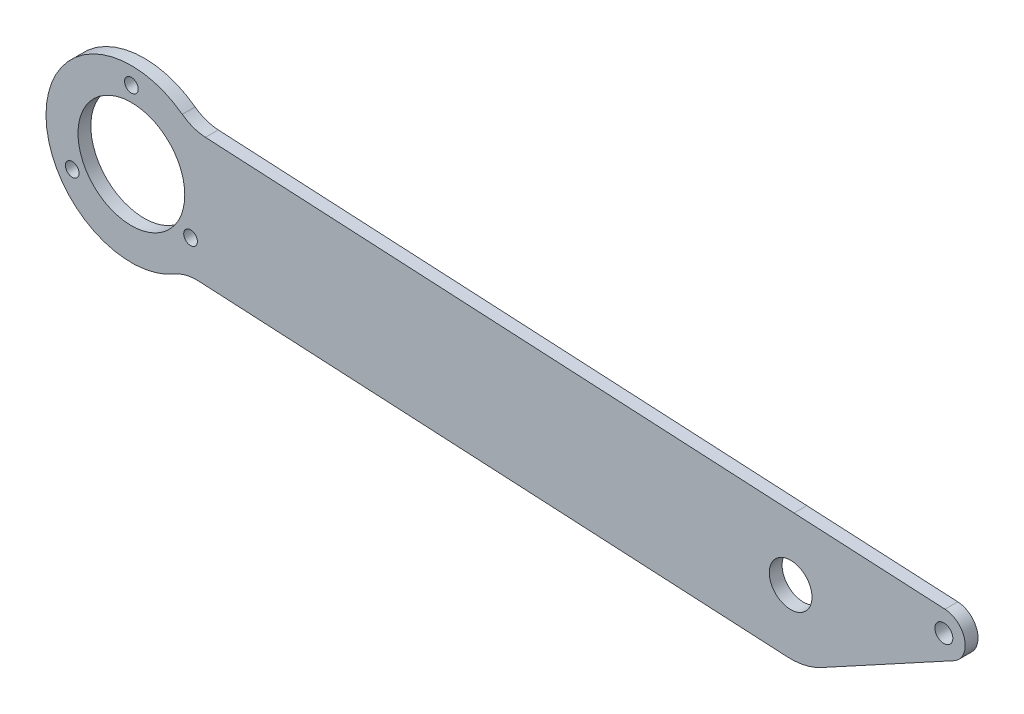
ISO-10303-21;
HEADER;
FILE_DESCRIPTION(('STEP AP214'),'2;1');
FILE_NAME('part.step','',(''),(''),'','','');
FILE_SCHEMA(('AUTOMOTIVE_DESIGN { 1 0 10303 214 1 1 1 1 }'));
ENDSEC;
DATA;
#1=APPLICATION_CONTEXT('core data for automotive mechanical design processes');
#2=APPLICATION_PROTOCOL_DEFINITION('international standard','automotive_design',2000,#1);
#3=PRODUCT_CONTEXT('',#1,'mechanical');
#4=PRODUCT('Part','Part','',(#3));
#5=PRODUCT_RELATED_PRODUCT_CATEGORY('part','',(#4));
#6=PRODUCT_DEFINITION_FORMATION('','',#4);
#7=PRODUCT_DEFINITION_CONTEXT('part definition',#1,'design');
#8=PRODUCT_DEFINITION('design','',#6,#7);
#9=PRODUCT_DEFINITION_SHAPE('','',#8);
#10=(LENGTH_UNIT() NAMED_UNIT(*) SI_UNIT(.MILLI.,.METRE.));
#11=(NAMED_UNIT(*) PLANE_ANGLE_UNIT() SI_UNIT($,.RADIAN.));
#12=(NAMED_UNIT(*) SI_UNIT($,.STERADIAN.) SOLID_ANGLE_UNIT());
#13=UNCERTAINTY_MEASURE_WITH_UNIT(LENGTH_MEASURE(1.E-05),#10,'distance_accuracy_value','');
#14=(GEOMETRIC_REPRESENTATION_CONTEXT(3) GLOBAL_UNCERTAINTY_ASSIGNED_CONTEXT((#13)) GLOBAL_UNIT_ASSIGNED_CONTEXT((#10,
#11,#12)) REPRESENTATION_CONTEXT('',''));
#15=CARTESIAN_POINT('',(0.,0.,0.));
#16=DIRECTION('',(0.,0.,1.));
#17=DIRECTION('',(1.,0.,0.));
#18=AXIS2_PLACEMENT_3D('',#15,#16,#17);
#19=CARTESIAN_POINT('',(15.241508082376,-25.839822587914,3.));
#20=DIRECTION('',(0.,0.,-1.));
#21=DIRECTION('',(-1.,0.,0.));
#22=AXIS2_PLACEMENT_3D('',#19,#20,#21);
#23=CYLINDRICAL_SURFACE('',#22,10.);
#24=DIRECTION('',(0.,0.,1.));
#25=VECTOR('',#24,1.);
#26=CARTESIAN_POINT('',(15.7689222913527,-15.853740560804,3.));
#27=LINE('',#26,#25);
#28=CARTESIAN_POINT('',(15.7689222913527,-15.853740560804,3.));
#29=VERTEX_POINT('',#28);
#30=CARTESIAN_POINT('',(15.7689222913527,-15.853740560804,0.));
#31=VERTEX_POINT('',#30);
#32=EDGE_CURVE('E149',#29,#31,#27,.F.);
#33=ORIENTED_EDGE('',*,*,#32,.F.);
#34=CARTESIAN_POINT('',(15.241508082376,-25.839822587914,3.));
#35=DIRECTION('',(0.,0.,1.));
#36=DIRECTION('',(1.,0.,0.));
#37=AXIS2_PLACEMENT_3D('',#34,#35,#36);
#38=CIRCLE('',#37,10.);
#39=CARTESIAN_POINT('',(10.1610053882507,-17.2265483919426,3.));
#40=VERTEX_POINT('',#39);
#41=EDGE_CURVE('E46',#29,#40,#38,.T.);
#42=ORIENTED_EDGE('',*,*,#41,.T.);
#43=DIRECTION('',(0.,0.,-1.));
#44=VECTOR('',#43,1.);
#45=CARTESIAN_POINT('',(10.1610053882507,-17.2265483919427,3.));
#46=LINE('',#45,#44);
#47=CARTESIAN_POINT('',(10.1610053882507,-17.2265483919426,0.));
#48=VERTEX_POINT('',#47);
#49=EDGE_CURVE('E152',#48,#40,#46,.F.);
#50=ORIENTED_EDGE('',*,*,#49,.F.);
#51=CARTESIAN_POINT('',(15.241508082376,-25.839822587914,0.));
#52=DIRECTION('',(0.,0.,1.));
#53=DIRECTION('',(1.,0.,0.));
#54=AXIS2_PLACEMENT_3D('',#51,#52,#53);
#55=CIRCLE('',#54,10.);
#56=EDGE_CURVE('E11',#48,#31,#55,.F.);
#57=ORIENTED_EDGE('',*,*,#56,.T.);
#58=EDGE_LOOP('',(#33,#42,#50,#57));
#59=FACE_BOUND('',#58,.T.);
#60=ADVANCED_FACE('F39',(#59),#23,.F.);
#61=CARTESIAN_POINT('',(17.8785791272596,24.0905875476361,3.));
#62=DIRECTION('',(0.,0.,-1.));
#63=DIRECTION('',(-1.,0.,0.));
#64=AXIS2_PLACEMENT_3D('',#61,#62,#63);
#65=CYLINDRICAL_SURFACE('',#64,10.);
#66=DIRECTION('',(0.,0.,-1.));
#67=VECTOR('',#66,1.);
#68=CARTESIAN_POINT('',(11.9190527515064,16.0603916984241,3.));
#69=LINE('',#68,#67);
#70=CARTESIAN_POINT('',(11.9190527515064,16.0603916984241,3.));
#71=VERTEX_POINT('',#70);
#72=CARTESIAN_POINT('',(11.9190527515064,16.0603916984241,0.));
#73=VERTEX_POINT('',#72);
#74=EDGE_CURVE('E134',#71,#73,#69,.T.);
#75=ORIENTED_EDGE('',*,*,#74,.F.);
#76=CARTESIAN_POINT('',(17.8785791272596,24.0905875476361,3.));
#77=DIRECTION('',(0.,0.,1.));
#78=DIRECTION('',(1.,0.,0.));
#79=AXIS2_PLACEMENT_3D('',#76,#77,#78);
#80=CIRCLE('',#79,10.);
#81=CARTESIAN_POINT('',(17.3511649182829,14.1045055205261,3.));
#82=VERTEX_POINT('',#81);
#83=EDGE_CURVE('E145',#71,#82,#80,.T.);
#84=ORIENTED_EDGE('',*,*,#83,.T.);
#85=DIRECTION('',(0.,0.,1.));
#86=VECTOR('',#85,1.);
#87=CARTESIAN_POINT('',(17.3511649182829,14.1045055205261,3.));
#88=LINE('',#87,#86);
#89=CARTESIAN_POINT('',(17.3511649182829,14.1045055205261,0.));
#90=VERTEX_POINT('',#89);
#91=EDGE_CURVE('E137',#90,#82,#88,.T.);
#92=ORIENTED_EDGE('',*,*,#91,.F.);
#93=CARTESIAN_POINT('',(17.8785791272596,24.0905875476361,0.));
#94=DIRECTION('',(0.,0.,1.));
#95=DIRECTION('',(1.,0.,0.));
#96=AXIS2_PLACEMENT_3D('',#93,#94,#95);
#97=CIRCLE('',#96,10.);
#98=EDGE_CURVE('E147',#90,#73,#97,.F.);
#99=ORIENTED_EDGE('',*,*,#98,.T.);
#100=EDGE_LOOP('',(#75,#84,#92,#99));
#101=FACE_BOUND('',#100,.T.);
#102=ADVANCED_FACE('F214',(#101),#65,.F.);
#103=CARTESIAN_POINT('',(190.28,0.,3.));
#104=DIRECTION('',(0.,0.,1.));
#105=DIRECTION('',(1.,0.,0.));
#106=AXIS2_PLACEMENT_3D('',#103,#104,#105);
#107=PLANE('',#106);
#108=ORIENTED_EDGE('',*,*,#41,.F.);
#109=DIRECTION('',(0.998608202711,-0.0527414208976724,0.));
#110=VECTOR('',#109,1.);
#111=CARTESIAN_POINT('',(12.4192234943473,-15.6768264581021,3.));
#112=LINE('',#111,#110);
#113=CARTESIAN_POINT('',(153.603692907683,-23.1334741256541,3.));
#114=VERTEX_POINT('',#113);
#115=EDGE_CURVE('E161',#29,#114,#112,.T.);
#116=ORIENTED_EDGE('',*,*,#115,.T.);
#117=CARTESIAN_POINT('',(154.394814221148,-8.15435108498915,3.));
#118=DIRECTION('',(0.,0.,1.));
#119=DIRECTION('',(1.,0.,0.));
#120=AXIS2_PLACEMENT_3D('',#117,#118,#119);
#121=CIRCLE('',#120,15.);
#122=CARTESIAN_POINT('',(161.568286956574,-21.3278581698202,3.));
#123=VERTEX_POINT('',#122);
#124=EDGE_CURVE('E163',#114,#123,#121,.T.);
#125=ORIENTED_EDGE('',*,*,#124,.T.);
#126=DIRECTION('',(0.878233805655407,0.478231515695088,0.));
#127=VECTOR('',#126,1.);
#128=CARTESIAN_POINT('',(161.568286956574,-21.3278581698202,3.));
#129=LINE('',#128,#127);
#130=CARTESIAN_POINT('',(192.671157578475,-4.39116902827702,3.));
#131=VERTEX_POINT('',#130);
#132=EDGE_CURVE('E125',#123,#131,#129,.T.);
#133=ORIENTED_EDGE('',*,*,#132,.T.);
#134=CARTESIAN_POINT('',(190.28,0.,3.));
#135=DIRECTION('',(0.,0.,1.));
#136=DIRECTION('',(1.,0.,0.));
#137=AXIS2_PLACEMENT_3D('',#134,#135,#136);
#138=CIRCLE('',#137,4.99999999999999);
#139=CARTESIAN_POINT('',(190.538680800823,4.99330394060743,3.));
#140=VERTEX_POINT('',#139);
#141=EDGE_CURVE('E119',#131,#140,#138,.T.);
#142=ORIENTED_EDGE('',*,*,#141,.T.);
#143=DIRECTION('',(-0.998660788121489,0.0517361601645036,0.));
#144=VECTOR('',#143,1.);
#145=CARTESIAN_POINT('',(190.538680800823,4.99330394060743,3.));
#146=LINE('',#145,#144);
#147=CARTESIAN_POINT('',(155.185935534613,6.82477195567584,3.));
#148=VERTEX_POINT('',#147);
#149=EDGE_CURVE('E107',#140,#148,#146,.T.);
#150=ORIENTED_EDGE('',*,*,#149,.T.);
#151=DIRECTION('',(-0.998608202711,0.0527414208976726,0.));
#152=VECTOR('',#151,1.);
#153=CARTESIAN_POINT('',(14.0014661212776,14.2814196232279,3.));
#154=LINE('',#153,#152);
#155=EDGE_CURVE('E118',#148,#82,#154,.T.);
#156=ORIENTED_EDGE('',*,*,#155,.T.);
#157=ORIENTED_EDGE('',*,*,#83,.F.);
#158=CARTESIAN_POINT('',(0.,0.,3.));
#159=DIRECTION('',(0.,0.,1.));
#160=DIRECTION('',(1.,0.,0.));
#161=AXIS2_PLACEMENT_3D('',#158,#159,#160);
#162=CIRCLE('',#161,20.);
#163=EDGE_CURVE('E158',#71,#40,#162,.T.);
#164=ORIENTED_EDGE('',*,*,#163,.T.);
#165=EDGE_LOOP('',(#108,#116,#125,#133,#142,#150,#156,#157,#164));
#166=FACE_BOUND('',#165,.T.);
#167=CARTESIAN_POINT('',(13.856406460551,-8.00000000000007,3.));
#168=DIRECTION('',(0.,0.,1.));
#169=DIRECTION('',(1.,0.,0.));
#170=AXIS2_PLACEMENT_3D('',#167,#168,#169);
#171=CIRCLE('',#170,1.6);
#172=CARTESIAN_POINT('',(15.456406460551,-8.00000000000007,3.));
#173=VERTEX_POINT('',#172);
#174=EDGE_CURVE('E273',#173,#173,#171,.T.);
#175=ORIENTED_EDGE('',*,*,#174,.F.);
#176=EDGE_LOOP('',(#175));
#177=FACE_BOUND('',#176,.T.);
#178=CARTESIAN_POINT('',(0.,0.,3.));
#179=DIRECTION('',(0.,0.,1.));
#180=DIRECTION('',(1.,0.,0.));
#181=AXIS2_PLACEMENT_3D('',#178,#179,#180);
#182=CIRCLE('',#181,12.5);
#183=CARTESIAN_POINT('',(12.5,0.,3.));
#184=VERTEX_POINT('',#183);
#185=EDGE_CURVE('E285',#184,#184,#182,.T.);
#186=ORIENTED_EDGE('',*,*,#185,.F.);
#187=EDGE_LOOP('',(#186));
#188=FACE_BOUND('',#187,.T.);
#189=CARTESIAN_POINT('',(154.394814221148,-8.15435108498915,3.));
#190=DIRECTION('',(0.,0.,1.));
#191=DIRECTION('',(1.,0.,0.));
#192=AXIS2_PLACEMENT_3D('',#189,#190,#191);
#193=CIRCLE('',#192,4.99999999999999);
#194=CARTESIAN_POINT('',(159.394814221148,-8.15435108498915,3.));
#195=VERTEX_POINT('',#194);
#196=EDGE_CURVE('E172',#195,#195,#193,.T.);
#197=ORIENTED_EDGE('',*,*,#196,.F.);
#198=EDGE_LOOP('',(#197));
#199=FACE_BOUND('',#198,.T.);
#200=CARTESIAN_POINT('',(190.28,0.,3.));
#201=DIRECTION('',(0.,0.,1.));
#202=DIRECTION('',(1.,0.,0.));
#203=AXIS2_PLACEMENT_3D('',#200,#201,#202);
#204=CIRCLE('',#203,2.09999999999999);
#205=CARTESIAN_POINT('',(192.38,0.,3.));
#206=VERTEX_POINT('',#205);
#207=EDGE_CURVE('E291',#206,#206,#204,.T.);
#208=ORIENTED_EDGE('',*,*,#207,.F.);
#209=EDGE_LOOP('',(#208));
#210=FACE_BOUND('',#209,.T.);
#211=CARTESIAN_POINT('',(0.,16.,3.));
#212=DIRECTION('',(0.,0.,1.));
#213=DIRECTION('',(1.,0.,0.));
#214=AXIS2_PLACEMENT_3D('',#211,#212,#213);
#215=CIRCLE('',#214,1.6);
#216=CARTESIAN_POINT('',(1.6,16.,3.));
#217=VERTEX_POINT('',#216);
#218=EDGE_CURVE('E279',#217,#217,#215,.T.);
#219=ORIENTED_EDGE('',*,*,#218,.F.);
#220=EDGE_LOOP('',(#219));
#221=FACE_BOUND('',#220,.T.);
#222=CARTESIAN_POINT('',(-13.8564064605511,-7.99999999999987,3.));
#223=DIRECTION('',(0.,0.,1.));
#224=DIRECTION('',(1.,0.,0.));
#225=AXIS2_PLACEMENT_3D('',#222,#223,#224);
#226=CIRCLE('',#225,1.6);
#227=CARTESIAN_POINT('',(-12.2564064605511,-7.99999999999987,3.));
#228=VERTEX_POINT('',#227);
#229=EDGE_CURVE('E264',#228,#228,#226,.T.);
#230=ORIENTED_EDGE('',*,*,#229,.F.);
#231=EDGE_LOOP('',(#230));
#232=FACE_BOUND('',#231,.T.);
#233=ADVANCED_FACE('F122',(#166,#177,#188,#199,#210,#221,#232),#107,.T.);
#234=CARTESIAN_POINT('',(190.28,0.,0.));
#235=DIRECTION('',(0.,0.,1.));
#236=DIRECTION('',(1.,0.,0.));
#237=AXIS2_PLACEMENT_3D('',#234,#235,#236);
#238=PLANE('',#237);
#239=CARTESIAN_POINT('',(190.28,0.,0.));
#240=DIRECTION('',(0.,0.,1.));
#241=DIRECTION('',(1.,0.,0.));
#242=AXIS2_PLACEMENT_3D('',#239,#240,#241);
#243=CIRCLE('',#242,4.99999999999999);
#244=CARTESIAN_POINT('',(192.671157578475,-4.39116902827702,0.));
#245=VERTEX_POINT('',#244);
#246=CARTESIAN_POINT('',(190.538680800823,4.99330394060743,0.));
#247=VERTEX_POINT('',#246);
#248=EDGE_CURVE('E133',#245,#247,#243,.T.);
#249=ORIENTED_EDGE('',*,*,#248,.F.);
#250=DIRECTION('',(0.878233805655407,0.478231515695088,0.));
#251=VECTOR('',#250,1.);
#252=CARTESIAN_POINT('',(161.568286956574,-21.3278581698202,0.));
#253=LINE('',#252,#251);
#254=CARTESIAN_POINT('',(161.568286956574,-21.3278581698202,0.));
#255=VERTEX_POINT('',#254);
#256=EDGE_CURVE('E129',#255,#245,#253,.T.);
#257=ORIENTED_EDGE('',*,*,#256,.F.);
#258=CARTESIAN_POINT('',(154.394814221148,-8.15435108498915,0.));
#259=DIRECTION('',(0.,0.,1.));
#260=DIRECTION('',(1.,0.,0.));
#261=AXIS2_PLACEMENT_3D('',#258,#259,#260);
#262=CIRCLE('',#261,15.);
#263=CARTESIAN_POINT('',(153.603692907683,-23.1334741256541,0.));
#264=VERTEX_POINT('',#263);
#265=EDGE_CURVE('E180',#264,#255,#262,.T.);
#266=ORIENTED_EDGE('',*,*,#265,.F.);
#267=DIRECTION('',(0.998608202711,-0.0527414208976724,0.));
#268=VECTOR('',#267,1.);
#269=CARTESIAN_POINT('',(12.4192234943473,-15.6768264581021,0.));
#270=LINE('',#269,#268);
#271=EDGE_CURVE('E178',#31,#264,#270,.T.);
#272=ORIENTED_EDGE('',*,*,#271,.F.);
#273=ORIENTED_EDGE('',*,*,#56,.F.);
#274=CARTESIAN_POINT('',(0.,0.,0.));
#275=DIRECTION('',(0.,0.,1.));
#276=DIRECTION('',(1.,0.,0.));
#277=AXIS2_PLACEMENT_3D('',#274,#275,#276);
#278=CIRCLE('',#277,20.);
#279=EDGE_CURVE('E159',#73,#48,#278,.T.);
#280=ORIENTED_EDGE('',*,*,#279,.F.);
#281=ORIENTED_EDGE('',*,*,#98,.F.);
#282=DIRECTION('',(-0.998608202711,0.0527414208976726,0.));
#283=VECTOR('',#282,1.);
#284=CARTESIAN_POINT('',(14.0014661212776,14.2814196232279,0.));
#285=LINE('',#284,#283);
#286=CARTESIAN_POINT('',(155.185935534613,6.82477195567584,0.));
#287=VERTEX_POINT('',#286);
#288=EDGE_CURVE('E174',#287,#90,#285,.T.);
#289=ORIENTED_EDGE('',*,*,#288,.F.);
#290=DIRECTION('',(-0.998660788121489,0.0517361601645036,0.));
#291=VECTOR('',#290,1.);
#292=CARTESIAN_POINT('',(190.538680800823,4.99330394060743,0.));
#293=LINE('',#292,#291);
#294=EDGE_CURVE('E171',#247,#287,#293,.T.);
#295=ORIENTED_EDGE('',*,*,#294,.F.);
#296=EDGE_LOOP('',(#249,#257,#266,#272,#273,#280,#281,#289,#295));
#297=FACE_BOUND('',#296,.T.);
#298=CARTESIAN_POINT('',(154.394814221148,-8.15435108498915,0.));
#299=DIRECTION('',(0.,0.,1.));
#300=DIRECTION('',(1.,0.,0.));
#301=AXIS2_PLACEMENT_3D('',#298,#299,#300);
#302=CIRCLE('',#301,4.99999999999999);
#303=CARTESIAN_POINT('',(159.394814221148,-8.15435108498915,0.));
#304=VERTEX_POINT('',#303);
#305=EDGE_CURVE('E294',#304,#304,#302,.T.);
#306=ORIENTED_EDGE('',*,*,#305,.T.);
#307=EDGE_LOOP('',(#306));
#308=FACE_BOUND('',#307,.T.);
#309=CARTESIAN_POINT('',(190.28,0.,0.));
#310=DIRECTION('',(0.,0.,1.));
#311=DIRECTION('',(1.,0.,0.));
#312=AXIS2_PLACEMENT_3D('',#309,#310,#311);
#313=CIRCLE('',#312,2.09999999999999);
#314=CARTESIAN_POINT('',(192.38,0.,0.));
#315=VERTEX_POINT('',#314);
#316=EDGE_CURVE('E288',#315,#315,#313,.T.);
#317=ORIENTED_EDGE('',*,*,#316,.T.);
#318=EDGE_LOOP('',(#317));
#319=FACE_BOUND('',#318,.T.);
#320=CARTESIAN_POINT('',(0.,0.,0.));
#321=DIRECTION('',(0.,0.,1.));
#322=DIRECTION('',(1.,0.,0.));
#323=AXIS2_PLACEMENT_3D('',#320,#321,#322);
#324=CIRCLE('',#323,12.5);
#325=CARTESIAN_POINT('',(12.5,0.,0.));
#326=VERTEX_POINT('',#325);
#327=EDGE_CURVE('E282',#326,#326,#324,.T.);
#328=ORIENTED_EDGE('',*,*,#327,.T.);
#329=EDGE_LOOP('',(#328));
#330=FACE_BOUND('',#329,.T.);
#331=CARTESIAN_POINT('',(0.,16.,0.));
#332=DIRECTION('',(0.,0.,1.));
#333=DIRECTION('',(1.,0.,0.));
#334=AXIS2_PLACEMENT_3D('',#331,#332,#333);
#335=CIRCLE('',#334,1.6);
#336=CARTESIAN_POINT('',(1.6,16.,0.));
#337=VERTEX_POINT('',#336);
#338=EDGE_CURVE('E276',#337,#337,#335,.T.);
#339=ORIENTED_EDGE('',*,*,#338,.T.);
#340=EDGE_LOOP('',(#339));
#341=FACE_BOUND('',#340,.T.);
#342=CARTESIAN_POINT('',(13.856406460551,-8.00000000000007,0.));
#343=DIRECTION('',(0.,0.,1.));
#344=DIRECTION('',(1.,0.,0.));
#345=AXIS2_PLACEMENT_3D('',#342,#343,#344);
#346=CIRCLE('',#345,1.6);
#347=CARTESIAN_POINT('',(15.456406460551,-8.00000000000007,0.));
#348=VERTEX_POINT('',#347);
#349=EDGE_CURVE('E270',#348,#348,#346,.T.);
#350=ORIENTED_EDGE('',*,*,#349,.T.);
#351=EDGE_LOOP('',(#350));
#352=FACE_BOUND('',#351,.T.);
#353=CARTESIAN_POINT('',(-13.8564064605511,-7.99999999999987,0.));
#354=DIRECTION('',(0.,0.,1.));
#355=DIRECTION('',(1.,0.,0.));
#356=AXIS2_PLACEMENT_3D('',#353,#354,#355);
#357=CIRCLE('',#356,1.6);
#358=CARTESIAN_POINT('',(-12.2564064605511,-7.99999999999987,0.));
#359=VERTEX_POINT('',#358);
#360=EDGE_CURVE('E267',#359,#359,#357,.T.);
#361=ORIENTED_EDGE('',*,*,#360,.T.);
#362=EDGE_LOOP('',(#361));
#363=FACE_BOUND('',#362,.T.);
#364=ADVANCED_FACE('F196',(#297,#308,#319,#330,#341,#352,#363),#238,.F.);
#365=CARTESIAN_POINT('',(190.28,0.,3.));
#366=DIRECTION('',(0.,0.,-1.));
#367=DIRECTION('',(-1.,0.,0.));
#368=AXIS2_PLACEMENT_3D('',#365,#366,#367);
#369=CYLINDRICAL_SURFACE('',#368,4.99999999999999);
#370=ORIENTED_EDGE('',*,*,#248,.T.);
#371=DIRECTION('',(0.,0.,-1.));
#372=VECTOR('',#371,1.);
#373=CARTESIAN_POINT('',(190.538680800823,4.99330394060743,3.));
#374=LINE('',#373,#372);
#375=EDGE_CURVE('E111',#140,#247,#374,.T.);
#376=ORIENTED_EDGE('',*,*,#375,.F.);
#377=ORIENTED_EDGE('',*,*,#141,.F.);
#378=DIRECTION('',(0.,0.,-1.));
#379=VECTOR('',#378,1.);
#380=CARTESIAN_POINT('',(192.671157578475,-4.39116902827702,3.));
#381=LINE('',#380,#379);
#382=EDGE_CURVE('E169',#131,#245,#381,.T.);
#383=ORIENTED_EDGE('',*,*,#382,.T.);
#384=EDGE_LOOP('',(#370,#376,#377,#383));
#385=FACE_BOUND('',#384,.T.);
#386=ADVANCED_FACE('F131',(#385),#369,.T.);
#387=CARTESIAN_POINT('',(190.538680800823,4.99330394060743,3.));
#388=DIRECTION('',(-0.0517361601645036,-0.998660788121489,0.));
#389=DIRECTION('',(0.998660788121489,-0.0517361601645036,0.));
#390=AXIS2_PLACEMENT_3D('',#387,#388,#389);
#391=PLANE('',#390);
#392=ORIENTED_EDGE('',*,*,#294,.T.);
#393=DIRECTION('',(0.,0.,-1.));
#394=VECTOR('',#393,1.);
#395=CARTESIAN_POINT('',(155.185935534613,6.82477195567584,3.));
#396=LINE('',#395,#394);
#397=EDGE_CURVE('E114',#148,#287,#396,.T.);
#398=ORIENTED_EDGE('',*,*,#397,.F.);
#399=ORIENTED_EDGE('',*,*,#149,.F.);
#400=ORIENTED_EDGE('',*,*,#375,.T.);
#401=EDGE_LOOP('',(#392,#398,#399,#400));
#402=FACE_BOUND('',#401,.T.);
#403=ADVANCED_FACE('F109',(#402),#391,.F.);
#404=CARTESIAN_POINT('',(14.0014661212776,14.2814196232279,3.));
#405=DIRECTION('',(-0.0527414208976726,-0.998608202711,0.));
#406=DIRECTION('',(0.998608202711,-0.0527414208976726,0.));
#407=AXIS2_PLACEMENT_3D('',#404,#405,#406);
#408=PLANE('',#407);
#409=ORIENTED_EDGE('',*,*,#288,.T.);
#410=ORIENTED_EDGE('',*,*,#91,.T.);
#411=ORIENTED_EDGE('',*,*,#155,.F.);
#412=ORIENTED_EDGE('',*,*,#397,.T.);
#413=EDGE_LOOP('',(#409,#410,#411,#412));
#414=FACE_BOUND('',#413,.T.);
#415=ADVANCED_FACE('F224',(#414),#408,.F.);
#416=CARTESIAN_POINT('',(0.,0.,3.));
#417=DIRECTION('',(0.,0.,-1.));
#418=DIRECTION('',(-1.,0.,0.));
#419=AXIS2_PLACEMENT_3D('',#416,#417,#418);
#420=CYLINDRICAL_SURFACE('',#419,20.);
#421=ORIENTED_EDGE('',*,*,#279,.T.);
#422=ORIENTED_EDGE('',*,*,#49,.T.);
#423=ORIENTED_EDGE('',*,*,#163,.F.);
#424=ORIENTED_EDGE('',*,*,#74,.T.);
#425=EDGE_LOOP('',(#421,#422,#423,#424));
#426=FACE_BOUND('',#425,.T.);
#427=ADVANCED_FACE('F157',(#426),#420,.T.);
#428=CARTESIAN_POINT('',(12.4192234943473,-15.6768264581021,3.));
#429=DIRECTION('',(0.0527414208976724,0.998608202711,0.));
#430=DIRECTION('',(-0.998608202711,0.0527414208976724,0.));
#431=AXIS2_PLACEMENT_3D('',#428,#429,#430);
#432=PLANE('',#431);
#433=ORIENTED_EDGE('',*,*,#115,.F.);
#434=ORIENTED_EDGE('',*,*,#32,.T.);
#435=ORIENTED_EDGE('',*,*,#271,.T.);
#436=DIRECTION('',(0.,0.,-1.));
#437=VECTOR('',#436,1.);
#438=CARTESIAN_POINT('',(153.603692907683,-23.1334741256541,3.));
#439=LINE('',#438,#437);
#440=EDGE_CURVE('E139',#114,#264,#439,.T.);
#441=ORIENTED_EDGE('',*,*,#440,.F.);
#442=EDGE_LOOP('',(#433,#434,#435,#441));
#443=FACE_BOUND('',#442,.T.);
#444=ADVANCED_FACE('F210',(#443),#432,.F.);
#445=CARTESIAN_POINT('',(154.394814221148,-8.15435108498915,3.));
#446=DIRECTION('',(0.,0.,-1.));
#447=DIRECTION('',(-1.,0.,0.));
#448=AXIS2_PLACEMENT_3D('',#445,#446,#447);
#449=CYLINDRICAL_SURFACE('',#448,15.);
#450=ORIENTED_EDGE('',*,*,#265,.T.);
#451=DIRECTION('',(0.,0.,-1.));
#452=VECTOR('',#451,1.);
#453=CARTESIAN_POINT('',(161.568286956574,-21.3278581698202,3.));
#454=LINE('',#453,#452);
#455=EDGE_CURVE('E184',#123,#255,#454,.T.);
#456=ORIENTED_EDGE('',*,*,#455,.F.);
#457=ORIENTED_EDGE('',*,*,#124,.F.);
#458=ORIENTED_EDGE('',*,*,#440,.T.);
#459=EDGE_LOOP('',(#450,#456,#457,#458));
#460=FACE_BOUND('',#459,.T.);
#461=ADVANCED_FACE('F191',(#460),#449,.T.);
#462=CARTESIAN_POINT('',(161.568286956574,-21.3278581698202,3.));
#463=DIRECTION('',(-0.478231515695088,0.878233805655407,0.));
#464=DIRECTION('',(-0.878233805655407,-0.478231515695088,0.));
#465=AXIS2_PLACEMENT_3D('',#462,#463,#464);
#466=PLANE('',#465);
#467=ORIENTED_EDGE('',*,*,#256,.T.);
#468=ORIENTED_EDGE('',*,*,#382,.F.);
#469=ORIENTED_EDGE('',*,*,#132,.F.);
#470=ORIENTED_EDGE('',*,*,#455,.T.);
#471=EDGE_LOOP('',(#467,#468,#469,#470));
#472=FACE_BOUND('',#471,.T.);
#473=ADVANCED_FACE('F199',(#472),#466,.F.);
#474=CARTESIAN_POINT('',(154.394814221148,-8.15435108498915,3.));
#475=DIRECTION('',(0.,0.,-1.));
#476=DIRECTION('',(-1.,0.,0.));
#477=AXIS2_PLACEMENT_3D('',#474,#475,#476);
#478=CYLINDRICAL_SURFACE('',#477,4.99999999999999);
#479=ORIENTED_EDGE('',*,*,#196,.T.);
#480=EDGE_LOOP('',(#479));
#481=FACE_BOUND('',#480,.T.);
#482=ORIENTED_EDGE('',*,*,#305,.F.);
#483=EDGE_LOOP('',(#482));
#484=FACE_BOUND('',#483,.T.);
#485=ADVANCED_FACE('F201',(#481,#484),#478,.F.);
#486=CARTESIAN_POINT('',(190.28,0.,3.));
#487=DIRECTION('',(0.,0.,-1.));
#488=DIRECTION('',(-1.,0.,0.));
#489=AXIS2_PLACEMENT_3D('',#486,#487,#488);
#490=CYLINDRICAL_SURFACE('',#489,2.09999999999999);
#491=ORIENTED_EDGE('',*,*,#207,.T.);
#492=EDGE_LOOP('',(#491));
#493=FACE_BOUND('',#492,.T.);
#494=ORIENTED_EDGE('',*,*,#316,.F.);
#495=EDGE_LOOP('',(#494));
#496=FACE_BOUND('',#495,.T.);
#497=ADVANCED_FACE('F207',(#493,#496),#490,.F.);
#498=CARTESIAN_POINT('',(0.,0.,3.));
#499=DIRECTION('',(0.,0.,-1.));
#500=DIRECTION('',(-1.,0.,0.));
#501=AXIS2_PLACEMENT_3D('',#498,#499,#500);
#502=CYLINDRICAL_SURFACE('',#501,12.5);
#503=ORIENTED_EDGE('',*,*,#185,.T.);
#504=EDGE_LOOP('',(#503));
#505=FACE_BOUND('',#504,.T.);
#506=ORIENTED_EDGE('',*,*,#327,.F.);
#507=EDGE_LOOP('',(#506));
#508=FACE_BOUND('',#507,.T.);
#509=ADVANCED_FACE('F243',(#505,#508),#502,.F.);
#510=CARTESIAN_POINT('',(0.,16.,3.));
#511=DIRECTION('',(0.,0.,-1.));
#512=DIRECTION('',(-1.,0.,0.));
#513=AXIS2_PLACEMENT_3D('',#510,#511,#512);
#514=CYLINDRICAL_SURFACE('',#513,1.6);
#515=ORIENTED_EDGE('',*,*,#218,.T.);
#516=EDGE_LOOP('',(#515));
#517=FACE_BOUND('',#516,.T.);
#518=ORIENTED_EDGE('',*,*,#338,.F.);
#519=EDGE_LOOP('',(#518));
#520=FACE_BOUND('',#519,.T.);
#521=ADVANCED_FACE('F247',(#517,#520),#514,.F.);
#522=CARTESIAN_POINT('',(13.856406460551,-8.00000000000007,3.));
#523=DIRECTION('',(0.,0.,-1.));
#524=DIRECTION('',(-1.,0.,0.));
#525=AXIS2_PLACEMENT_3D('',#522,#523,#524);
#526=CYLINDRICAL_SURFACE('',#525,1.6);
#527=ORIENTED_EDGE('',*,*,#174,.T.);
#528=EDGE_LOOP('',(#527));
#529=FACE_BOUND('',#528,.T.);
#530=ORIENTED_EDGE('',*,*,#349,.F.);
#531=EDGE_LOOP('',(#530));
#532=FACE_BOUND('',#531,.T.);
#533=ADVANCED_FACE('F251',(#529,#532),#526,.F.);
#534=CARTESIAN_POINT('',(-13.8564064605511,-7.99999999999987,3.));
#535=DIRECTION('',(0.,0.,-1.));
#536=DIRECTION('',(-1.,0.,0.));
#537=AXIS2_PLACEMENT_3D('',#534,#535,#536);
#538=CYLINDRICAL_SURFACE('',#537,1.6);
#539=ORIENTED_EDGE('',*,*,#229,.T.);
#540=EDGE_LOOP('',(#539));
#541=FACE_BOUND('',#540,.T.);
#542=ORIENTED_EDGE('',*,*,#360,.F.);
#543=EDGE_LOOP('',(#542));
#544=FACE_BOUND('',#543,.T.);
#545=ADVANCED_FACE('F255',(#541,#544),#538,.F.);
#546=CLOSED_SHELL('',(#60,#102,#233,#364,#386,#403,#415,#427,#444,#461,#473,#485,#497,#509,#521,
#533,#545));
#547=MANIFOLD_SOLID_BREP('B2',#546);
#548=ADVANCED_BREP_SHAPE_REPRESENTATION('',(#18,#547),#14);
#549=SHAPE_DEFINITION_REPRESENTATION(#9,#548);
ENDSEC;
END-ISO-10303-21;
